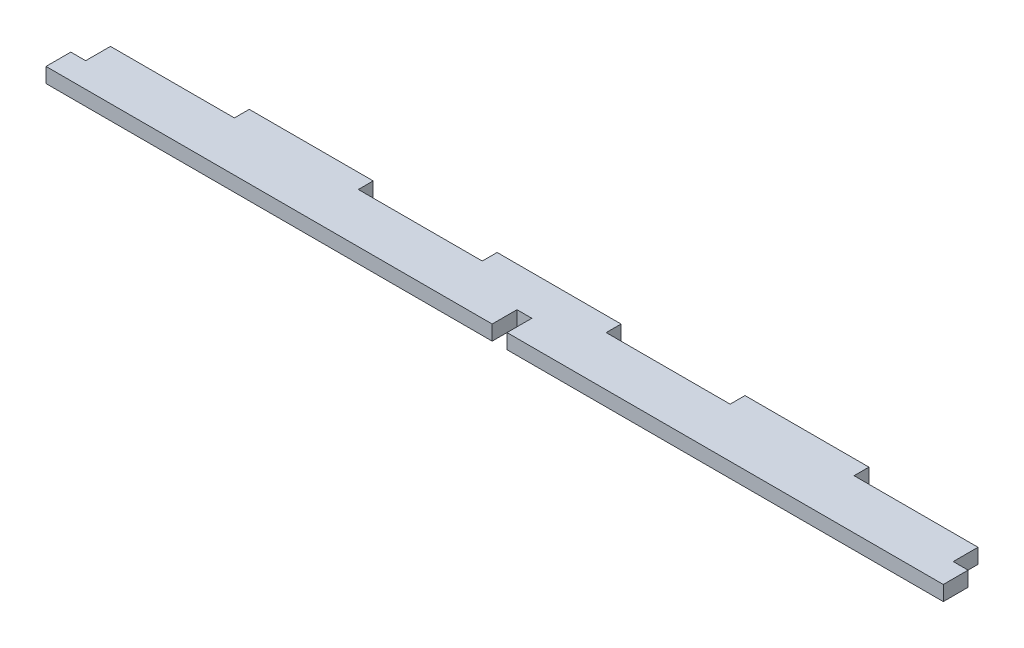
ISO-10303-21;
HEADER;
FILE_DESCRIPTION(('STEP AP214'),'2;1');
FILE_NAME('part.step','',(''),(''),'','','');
FILE_SCHEMA(('AUTOMOTIVE_DESIGN { 1 0 10303 214 1 1 1 1 }'));
ENDSEC;
DATA;
#1=APPLICATION_CONTEXT('core data for automotive mechanical design processes');
#2=APPLICATION_PROTOCOL_DEFINITION('international standard','automotive_design',2000,#1);
#3=PRODUCT_CONTEXT('',#1,'mechanical');
#4=PRODUCT('Part','Part','',(#3));
#5=PRODUCT_RELATED_PRODUCT_CATEGORY('part','',(#4));
#6=PRODUCT_DEFINITION_FORMATION('','',#4);
#7=PRODUCT_DEFINITION_CONTEXT('part definition',#1,'design');
#8=PRODUCT_DEFINITION('design','',#6,#7);
#9=PRODUCT_DEFINITION_SHAPE('','',#8);
#10=(LENGTH_UNIT() NAMED_UNIT(*) SI_UNIT(.MILLI.,.METRE.));
#11=(NAMED_UNIT(*) PLANE_ANGLE_UNIT() SI_UNIT($,.RADIAN.));
#12=(NAMED_UNIT(*) SI_UNIT($,.STERADIAN.) SOLID_ANGLE_UNIT());
#13=UNCERTAINTY_MEASURE_WITH_UNIT(LENGTH_MEASURE(1.E-05),#10,'distance_accuracy_value','');
#14=(GEOMETRIC_REPRESENTATION_CONTEXT(3) GLOBAL_UNCERTAINTY_ASSIGNED_CONTEXT((#13)) GLOBAL_UNIT_ASSIGNED_CONTEXT((#10,
#11,#12)) REPRESENTATION_CONTEXT('',''));
#15=CARTESIAN_POINT('',(0.,0.,0.));
#16=DIRECTION('',(0.,0.,1.));
#17=DIRECTION('',(1.,0.,0.));
#18=AXIS2_PLACEMENT_3D('',#15,#16,#17);
#19=CARTESIAN_POINT('',(0.,3.,0.));
#20=DIRECTION('',(0.,0.,-1.));
#21=DIRECTION('',(-1.,0.,0.));
#22=AXIS2_PLACEMENT_3D('',#19,#20,#21);
#23=PLANE('',#22);
#24=DIRECTION('',(0.,-1.,0.));
#25=VECTOR('',#24,1.);
#26=CARTESIAN_POINT('',(87.,3.00005,0.));
#27=LINE('',#26,#25);
#28=CARTESIAN_POINT('',(87.,3.,0.));
#29=VERTEX_POINT('',#28);
#30=CARTESIAN_POINT('',(87.,0.,0.));
#31=VERTEX_POINT('',#30);
#32=EDGE_CURVE('E196',#29,#31,#27,.T.);
#33=ORIENTED_EDGE('',*,*,#32,.F.);
#34=DIRECTION('',(1.,0.,0.));
#35=VECTOR('',#34,1.);
#36=CARTESIAN_POINT('',(0.,3.,0.));
#37=LINE('',#36,#35);
#38=CARTESIAN_POINT('',(-3.,3.,0.));
#39=VERTEX_POINT('',#38);
#40=EDGE_CURVE('E241',#39,#29,#37,.T.);
#41=ORIENTED_EDGE('',*,*,#40,.F.);
#42=DIRECTION('',(0.,-1.,0.));
#43=VECTOR('',#42,1.);
#44=CARTESIAN_POINT('',(-3.,28.1793566240284,0.));
#45=LINE('',#44,#43);
#46=CARTESIAN_POINT('',(-3.,0.,0.));
#47=VERTEX_POINT('',#46);
#48=EDGE_CURVE('E218',#39,#47,#45,.T.);
#49=ORIENTED_EDGE('',*,*,#48,.T.);
#50=DIRECTION('',(1.,0.,0.));
#51=VECTOR('',#50,1.);
#52=CARTESIAN_POINT('',(0.,0.,0.));
#53=LINE('',#52,#51);
#54=EDGE_CURVE('E210',#47,#31,#53,.T.);
#55=ORIENTED_EDGE('',*,*,#54,.T.);
#56=EDGE_LOOP('',(#33,#41,#49,#55));
#57=FACE_BOUND('',#56,.T.);
#58=ADVANCED_FACE('F33',(#57),#23,.F.);
#59=DIRECTION('',(0.,-1.,0.));
#60=VECTOR('',#59,1.);
#61=CARTESIAN_POINT('',(90.,3.00005,0.));
#62=LINE('',#61,#60);
#63=CARTESIAN_POINT('',(90.,3.,0.));
#64=VERTEX_POINT('',#63);
#65=CARTESIAN_POINT('',(90.,0.,0.));
#66=VERTEX_POINT('',#65);
#67=EDGE_CURVE('E204',#64,#66,#62,.T.);
#68=ORIENTED_EDGE('',*,*,#67,.T.);
#69=CARTESIAN_POINT('',(178.,0.,0.));
#70=VERTEX_POINT('',#69);
#71=EDGE_CURVE('E221',#66,#70,#53,.T.);
#72=ORIENTED_EDGE('',*,*,#71,.T.);
#73=DIRECTION('',(0.,-1.,0.));
#74=VECTOR('',#73,1.);
#75=CARTESIAN_POINT('',(178.,28.1793566240284,0.));
#76=LINE('',#75,#74);
#77=CARTESIAN_POINT('',(178.,3.,0.));
#78=VERTEX_POINT('',#77);
#79=EDGE_CURVE('E284',#78,#70,#76,.T.);
#80=ORIENTED_EDGE('',*,*,#79,.F.);
#81=EDGE_CURVE('E462',#64,#78,#37,.T.);
#82=ORIENTED_EDGE('',*,*,#81,.F.);
#83=EDGE_LOOP('',(#68,#72,#80,#82));
#84=FACE_BOUND('',#83,.T.);
#85=ADVANCED_FACE('F431',(#84),#23,.F.);
#86=CARTESIAN_POINT('',(0.,3.,0.));
#87=DIRECTION('',(0.,1.,0.));
#88=DIRECTION('',(0.,0.,1.));
#89=AXIS2_PLACEMENT_3D('',#86,#87,#88);
#90=PLANE('',#89);
#91=ORIENTED_EDGE('',*,*,#40,.T.);
#92=DIRECTION('',(0.,0.,-1.));
#93=VECTOR('',#92,1.);
#94=CARTESIAN_POINT('',(87.,3.,0.));
#95=LINE('',#94,#93);
#96=CARTESIAN_POINT('',(87.,3.,-5.));
#97=VERTEX_POINT('',#96);
#98=EDGE_CURVE('E199',#29,#97,#95,.T.);
#99=ORIENTED_EDGE('',*,*,#98,.T.);
#100=DIRECTION('',(1.,0.,0.));
#101=VECTOR('',#100,1.);
#102=CARTESIAN_POINT('',(0.,3.,-5.));
#103=LINE('',#102,#101);
#104=CARTESIAN_POINT('',(90.,3.,-5.));
#105=VERTEX_POINT('',#104);
#106=EDGE_CURVE('E203',#97,#105,#103,.T.);
#107=ORIENTED_EDGE('',*,*,#106,.T.);
#108=DIRECTION('',(0.,0.,1.));
#109=VECTOR('',#108,1.);
#110=CARTESIAN_POINT('',(90.,3.,0.));
#111=LINE('',#110,#109);
#112=EDGE_CURVE('E473',#105,#64,#111,.T.);
#113=ORIENTED_EDGE('',*,*,#112,.T.);
#114=ORIENTED_EDGE('',*,*,#81,.T.);
#115=DIRECTION('',(0.,0.,-1.));
#116=VECTOR('',#115,1.);
#117=CARTESIAN_POINT('',(178.,3.,0.));
#118=LINE('',#117,#116);
#119=CARTESIAN_POINT('',(178.,3.,-5.00000000000002));
#120=VERTEX_POINT('',#119);
#121=EDGE_CURVE('E280',#78,#120,#118,.T.);
#122=ORIENTED_EDGE('',*,*,#121,.T.);
#123=DIRECTION('',(-1.,0.,0.));
#124=VECTOR('',#123,1.);
#125=CARTESIAN_POINT('',(175.,3.,-5.00000000000002));
#126=LINE('',#125,#124);
#127=CARTESIAN_POINT('',(175.,3.,-5.00000000000002));
#128=VERTEX_POINT('',#127);
#129=EDGE_CURVE('E277',#120,#128,#126,.T.);
#130=ORIENTED_EDGE('',*,*,#129,.T.);
#131=DIRECTION('',(0.,0.,-1.));
#132=VECTOR('',#131,1.);
#133=CARTESIAN_POINT('',(175.,3.,-10.));
#134=LINE('',#133,#132);
#135=CARTESIAN_POINT('',(175.,3.,-10.));
#136=VERTEX_POINT('',#135);
#137=EDGE_CURVE('E237',#128,#136,#134,.T.);
#138=ORIENTED_EDGE('',*,*,#137,.T.);
#139=DIRECTION('',(-1.,0.,0.));
#140=VECTOR('',#139,1.);
#141=CARTESIAN_POINT('',(0.,3.,-10.));
#142=LINE('',#141,#140);
#143=CARTESIAN_POINT('',(150.,3.,-10.));
#144=VERTEX_POINT('',#143);
#145=EDGE_CURVE('E254',#136,#144,#142,.T.);
#146=ORIENTED_EDGE('',*,*,#145,.T.);
#147=DIRECTION('',(0.,0.,-1.));
#148=VECTOR('',#147,1.);
#149=CARTESIAN_POINT('',(150.,3.,-10.));
#150=LINE('',#149,#148);
#151=CARTESIAN_POINT('',(150.,3.,-13.));
#152=VERTEX_POINT('',#151);
#153=EDGE_CURVE('E370',#144,#152,#150,.T.);
#154=ORIENTED_EDGE('',*,*,#153,.T.);
#155=DIRECTION('',(-1.,0.,0.));
#156=VECTOR('',#155,1.);
#157=CARTESIAN_POINT('',(125.,3.,-13.));
#158=LINE('',#157,#156);
#159=CARTESIAN_POINT('',(125.,3.,-13.));
#160=VERTEX_POINT('',#159);
#161=EDGE_CURVE('E480',#152,#160,#158,.T.);
#162=ORIENTED_EDGE('',*,*,#161,.T.);
#163=DIRECTION('',(0.,0.,1.));
#164=VECTOR('',#163,1.);
#165=CARTESIAN_POINT('',(125.,3.,-10.));
#166=LINE('',#165,#164);
#167=CARTESIAN_POINT('',(125.,3.,-10.));
#168=VERTEX_POINT('',#167);
#169=EDGE_CURVE('E340',#160,#168,#166,.T.);
#170=ORIENTED_EDGE('',*,*,#169,.T.);
#171=CARTESIAN_POINT('',(100.,3.,-10.));
#172=VERTEX_POINT('',#171);
#173=EDGE_CURVE('E37',#168,#172,#142,.T.);
#174=ORIENTED_EDGE('',*,*,#173,.T.);
#175=DIRECTION('',(0.,0.,-1.));
#176=VECTOR('',#175,1.);
#177=CARTESIAN_POINT('',(100.,3.,-10.));
#178=LINE('',#177,#176);
#179=CARTESIAN_POINT('',(100.,3.,-13.));
#180=VERTEX_POINT('',#179);
#181=EDGE_CURVE('E337',#172,#180,#178,.T.);
#182=ORIENTED_EDGE('',*,*,#181,.T.);
#183=DIRECTION('',(-1.,0.,0.));
#184=VECTOR('',#183,1.);
#185=CARTESIAN_POINT('',(75.,3.,-13.));
#186=LINE('',#185,#184);
#187=CARTESIAN_POINT('',(75.,3.,-13.));
#188=VERTEX_POINT('',#187);
#189=EDGE_CURVE('E358',#180,#188,#186,.T.);
#190=ORIENTED_EDGE('',*,*,#189,.T.);
#191=DIRECTION('',(0.,0.,1.));
#192=VECTOR('',#191,1.);
#193=CARTESIAN_POINT('',(75.,3.,-10.));
#194=LINE('',#193,#192);
#195=CARTESIAN_POINT('',(75.,3.,-10.));
#196=VERTEX_POINT('',#195);
#197=EDGE_CURVE('E353',#188,#196,#194,.T.);
#198=ORIENTED_EDGE('',*,*,#197,.T.);
#199=CARTESIAN_POINT('',(50.,3.,-10.));
#200=VERTEX_POINT('',#199);
#201=EDGE_CURVE('E257',#196,#200,#142,.T.);
#202=ORIENTED_EDGE('',*,*,#201,.T.);
#203=DIRECTION('',(0.,0.,-1.));
#204=VECTOR('',#203,1.);
#205=CARTESIAN_POINT('',(50.,3.,-10.));
#206=LINE('',#205,#204);
#207=CARTESIAN_POINT('',(50.,3.,-13.));
#208=VERTEX_POINT('',#207);
#209=EDGE_CURVE('E285',#200,#208,#206,.T.);
#210=ORIENTED_EDGE('',*,*,#209,.T.);
#211=DIRECTION('',(-1.,0.,0.));
#212=VECTOR('',#211,1.);
#213=CARTESIAN_POINT('',(25.,3.,-13.));
#214=LINE('',#213,#212);
#215=CARTESIAN_POINT('',(25.,3.,-13.));
#216=VERTEX_POINT('',#215);
#217=EDGE_CURVE('E374',#208,#216,#214,.T.);
#218=ORIENTED_EDGE('',*,*,#217,.T.);
#219=DIRECTION('',(0.,0.,1.));
#220=VECTOR('',#219,1.);
#221=CARTESIAN_POINT('',(25.,3.,-10.));
#222=LINE('',#221,#220);
#223=CARTESIAN_POINT('',(25.,3.,-10.));
#224=VERTEX_POINT('',#223);
#225=EDGE_CURVE('E378',#216,#224,#222,.T.);
#226=ORIENTED_EDGE('',*,*,#225,.T.);
#227=CARTESIAN_POINT('',(0.,3.,-10.));
#228=VERTEX_POINT('',#227);
#229=EDGE_CURVE('E240',#224,#228,#142,.T.);
#230=ORIENTED_EDGE('',*,*,#229,.T.);
#231=DIRECTION('',(0.,0.,1.));
#232=VECTOR('',#231,1.);
#233=CARTESIAN_POINT('',(0.,3.,-10.));
#234=LINE('',#233,#232);
#235=CARTESIAN_POINT('',(0.,3.,-5.));
#236=VERTEX_POINT('',#235);
#237=EDGE_CURVE('E264',#228,#236,#234,.T.);
#238=ORIENTED_EDGE('',*,*,#237,.T.);
#239=DIRECTION('',(-1.,0.,0.));
#240=VECTOR('',#239,1.);
#241=CARTESIAN_POINT('',(0.,3.,-5.));
#242=LINE('',#241,#240);
#243=CARTESIAN_POINT('',(-3.,3.,-5.));
#244=VERTEX_POINT('',#243);
#245=EDGE_CURVE('E298',#236,#244,#242,.T.);
#246=ORIENTED_EDGE('',*,*,#245,.T.);
#247=DIRECTION('',(0.,0.,1.));
#248=VECTOR('',#247,1.);
#249=CARTESIAN_POINT('',(-3.,3.,0.));
#250=LINE('',#249,#248);
#251=EDGE_CURVE('E295',#244,#39,#250,.T.);
#252=ORIENTED_EDGE('',*,*,#251,.T.);
#253=EDGE_LOOP('',(#91,#99,#107,#113,#114,#122,#130,#138,#146,#154,#162,#170,#174,#182,#190,
#198,#202,#210,#218,#226,#230,#238,#246,#252));
#254=FACE_BOUND('',#253,.T.);
#255=ADVANCED_FACE('F317',(#254),#90,.T.);
#256=CARTESIAN_POINT('',(0.,0.,0.));
#257=DIRECTION('',(0.,1.,0.));
#258=DIRECTION('',(0.,0.,1.));
#259=AXIS2_PLACEMENT_3D('',#256,#257,#258);
#260=PLANE('',#259);
#261=DIRECTION('',(0.,0.,1.));
#262=VECTOR('',#261,1.);
#263=CARTESIAN_POINT('',(87.,0.,0.));
#264=LINE('',#263,#262);
#265=CARTESIAN_POINT('',(87.,0.,-5.));
#266=VERTEX_POINT('',#265);
#267=EDGE_CURVE('E51',#266,#31,#264,.T.);
#268=ORIENTED_EDGE('',*,*,#267,.T.);
#269=ORIENTED_EDGE('',*,*,#54,.F.);
#270=DIRECTION('',(0.,0.,1.));
#271=VECTOR('',#270,1.);
#272=CARTESIAN_POINT('',(-3.,0.,0.));
#273=LINE('',#272,#271);
#274=CARTESIAN_POINT('',(-3.,0.,-5.));
#275=VERTEX_POINT('',#274);
#276=EDGE_CURVE('E292',#275,#47,#273,.T.);
#277=ORIENTED_EDGE('',*,*,#276,.F.);
#278=DIRECTION('',(-1.,0.,0.));
#279=VECTOR('',#278,1.);
#280=CARTESIAN_POINT('',(0.,0.,-5.));
#281=LINE('',#280,#279);
#282=CARTESIAN_POINT('',(0.,0.,-5.));
#283=VERTEX_POINT('',#282);
#284=EDGE_CURVE('E307',#283,#275,#281,.T.);
#285=ORIENTED_EDGE('',*,*,#284,.F.);
#286=DIRECTION('',(0.,0.,1.));
#287=VECTOR('',#286,1.);
#288=CARTESIAN_POINT('',(0.,0.,-10.));
#289=LINE('',#288,#287);
#290=CARTESIAN_POINT('',(0.,0.,-10.));
#291=VERTEX_POINT('',#290);
#292=EDGE_CURVE('E225',#291,#283,#289,.T.);
#293=ORIENTED_EDGE('',*,*,#292,.F.);
#294=DIRECTION('',(-1.,0.,0.));
#295=VECTOR('',#294,1.);
#296=CARTESIAN_POINT('',(0.,0.,-10.));
#297=LINE('',#296,#295);
#298=CARTESIAN_POINT('',(25.,0.,-10.));
#299=VERTEX_POINT('',#298);
#300=EDGE_CURVE('E223',#299,#291,#297,.T.);
#301=ORIENTED_EDGE('',*,*,#300,.F.);
#302=DIRECTION('',(0.,0.,1.));
#303=VECTOR('',#302,1.);
#304=CARTESIAN_POINT('',(25.,0.,-10.));
#305=LINE('',#304,#303);
#306=CARTESIAN_POINT('',(25.,0.,-13.));
#307=VERTEX_POINT('',#306);
#308=EDGE_CURVE('E355',#307,#299,#305,.T.);
#309=ORIENTED_EDGE('',*,*,#308,.F.);
#310=DIRECTION('',(-1.,0.,0.));
#311=VECTOR('',#310,1.);
#312=CARTESIAN_POINT('',(25.,0.,-13.));
#313=LINE('',#312,#311);
#314=CARTESIAN_POINT('',(50.,0.,-13.));
#315=VERTEX_POINT('',#314);
#316=EDGE_CURVE('E371',#315,#307,#313,.T.);
#317=ORIENTED_EDGE('',*,*,#316,.F.);
#318=DIRECTION('',(0.,0.,-1.));
#319=VECTOR('',#318,1.);
#320=CARTESIAN_POINT('',(50.,0.,-10.));
#321=LINE('',#320,#319);
#322=CARTESIAN_POINT('',(50.,0.,-10.));
#323=VERTEX_POINT('',#322);
#324=EDGE_CURVE('E402',#323,#315,#321,.T.);
#325=ORIENTED_EDGE('',*,*,#324,.F.);
#326=CARTESIAN_POINT('',(75.,0.,-10.));
#327=VERTEX_POINT('',#326);
#328=EDGE_CURVE('E259',#327,#323,#297,.T.);
#329=ORIENTED_EDGE('',*,*,#328,.F.);
#330=DIRECTION('',(0.,0.,1.));
#331=VECTOR('',#330,1.);
#332=CARTESIAN_POINT('',(75.,0.,-10.));
#333=LINE('',#332,#331);
#334=CARTESIAN_POINT('',(75.,0.,-13.));
#335=VERTEX_POINT('',#334);
#336=EDGE_CURVE('E361',#335,#327,#333,.T.);
#337=ORIENTED_EDGE('',*,*,#336,.F.);
#338=DIRECTION('',(-1.,0.,0.));
#339=VECTOR('',#338,1.);
#340=CARTESIAN_POINT('',(75.,0.,-13.));
#341=LINE('',#340,#339);
#342=CARTESIAN_POINT('',(100.,0.,-13.));
#343=VERTEX_POINT('',#342);
#344=EDGE_CURVE('E365',#343,#335,#341,.T.);
#345=ORIENTED_EDGE('',*,*,#344,.F.);
#346=DIRECTION('',(0.,0.,-1.));
#347=VECTOR('',#346,1.);
#348=CARTESIAN_POINT('',(100.,0.,-10.));
#349=LINE('',#348,#347);
#350=CARTESIAN_POINT('',(100.,0.,-10.));
#351=VERTEX_POINT('',#350);
#352=EDGE_CURVE('E346',#351,#343,#349,.T.);
#353=ORIENTED_EDGE('',*,*,#352,.F.);
#354=CARTESIAN_POINT('',(125.,0.,-10.));
#355=VERTEX_POINT('',#354);
#356=EDGE_CURVE('E261',#355,#351,#297,.T.);
#357=ORIENTED_EDGE('',*,*,#356,.F.);
#358=DIRECTION('',(0.,0.,1.));
#359=VECTOR('',#358,1.);
#360=CARTESIAN_POINT('',(125.,0.,-10.));
#361=LINE('',#360,#359);
#362=CARTESIAN_POINT('',(125.,0.,-13.));
#363=VERTEX_POINT('',#362);
#364=EDGE_CURVE('E486',#363,#355,#361,.T.);
#365=ORIENTED_EDGE('',*,*,#364,.F.);
#366=DIRECTION('',(-1.,0.,0.));
#367=VECTOR('',#366,1.);
#368=CARTESIAN_POINT('',(125.,0.,-13.));
#369=LINE('',#368,#367);
#370=CARTESIAN_POINT('',(150.,0.,-13.));
#371=VERTEX_POINT('',#370);
#372=EDGE_CURVE('E477',#371,#363,#369,.T.);
#373=ORIENTED_EDGE('',*,*,#372,.F.);
#374=DIRECTION('',(0.,0.,-1.));
#375=VECTOR('',#374,1.);
#376=CARTESIAN_POINT('',(150.,0.,-10.));
#377=LINE('',#376,#375);
#378=CARTESIAN_POINT('',(150.,0.,-10.));
#379=VERTEX_POINT('',#378);
#380=EDGE_CURVE('E482',#379,#371,#377,.T.);
#381=ORIENTED_EDGE('',*,*,#380,.F.);
#382=CARTESIAN_POINT('',(175.,0.,-10.));
#383=VERTEX_POINT('',#382);
#384=EDGE_CURVE('E262',#383,#379,#297,.T.);
#385=ORIENTED_EDGE('',*,*,#384,.F.);
#386=DIRECTION('',(0.,0.,-1.));
#387=VECTOR('',#386,1.);
#388=CARTESIAN_POINT('',(175.,0.,-10.));
#389=LINE('',#388,#387);
#390=CARTESIAN_POINT('',(175.,0.,-5.00000000000002));
#391=VERTEX_POINT('',#390);
#392=EDGE_CURVE('E220',#391,#383,#389,.T.);
#393=ORIENTED_EDGE('',*,*,#392,.F.);
#394=DIRECTION('',(-1.,0.,0.));
#395=VECTOR('',#394,1.);
#396=CARTESIAN_POINT('',(175.,0.,-5.00000000000002));
#397=LINE('',#396,#395);
#398=CARTESIAN_POINT('',(178.,0.,-5.00000000000002));
#399=VERTEX_POINT('',#398);
#400=EDGE_CURVE('E242',#399,#391,#397,.T.);
#401=ORIENTED_EDGE('',*,*,#400,.F.);
#402=DIRECTION('',(0.,0.,-1.));
#403=VECTOR('',#402,1.);
#404=CARTESIAN_POINT('',(178.,0.,0.));
#405=LINE('',#404,#403);
#406=EDGE_CURVE('E452',#70,#399,#405,.T.);
#407=ORIENTED_EDGE('',*,*,#406,.F.);
#408=ORIENTED_EDGE('',*,*,#71,.F.);
#409=DIRECTION('',(0.,0.,-1.));
#410=VECTOR('',#409,1.);
#411=CARTESIAN_POINT('',(90.,0.,0.));
#412=LINE('',#411,#410);
#413=CARTESIAN_POINT('',(90.,0.,-5.));
#414=VERTEX_POINT('',#413);
#415=EDGE_CURVE('E215',#66,#414,#412,.T.);
#416=ORIENTED_EDGE('',*,*,#415,.T.);
#417=DIRECTION('',(-1.,0.,0.));
#418=VECTOR('',#417,1.);
#419=CARTESIAN_POINT('',(87.,0.,-5.));
#420=LINE('',#419,#418);
#421=EDGE_CURVE('E214',#414,#266,#420,.T.);
#422=ORIENTED_EDGE('',*,*,#421,.T.);
#423=EDGE_LOOP('',(#268,#269,#277,#285,#293,#301,#309,#317,#325,#329,#337,#345,#353,#357,#365,
#373,#381,#385,#393,#401,#407,#408,#416,#422));
#424=FACE_BOUND('',#423,.T.);
#425=ADVANCED_FACE('F208',(#424),#260,.F.);
#426=CARTESIAN_POINT('',(0.,3.,-10.));
#427=DIRECTION('',(0.,0.,1.));
#428=DIRECTION('',(1.,0.,0.));
#429=AXIS2_PLACEMENT_3D('',#426,#427,#428);
#430=PLANE('',#429);
#431=DIRECTION('',(0.,-1.,0.));
#432=VECTOR('',#431,1.);
#433=CARTESIAN_POINT('',(125.,28.1793566240284,-10.));
#434=LINE('',#433,#432);
#435=EDGE_CURVE('E489',#168,#355,#434,.T.);
#436=ORIENTED_EDGE('',*,*,#435,.T.);
#437=ORIENTED_EDGE('',*,*,#356,.T.);
#438=DIRECTION('',(0.,-1.,0.));
#439=VECTOR('',#438,1.);
#440=CARTESIAN_POINT('',(100.,28.1793566240284,-10.));
#441=LINE('',#440,#439);
#442=EDGE_CURVE('E341',#172,#351,#441,.T.);
#443=ORIENTED_EDGE('',*,*,#442,.F.);
#444=ORIENTED_EDGE('',*,*,#173,.F.);
#445=EDGE_LOOP('',(#436,#437,#443,#444));
#446=FACE_BOUND('',#445,.T.);
#447=ADVANCED_FACE('F342',(#446),#430,.F.);
#448=DIRECTION('',(0.,-1.,0.));
#449=VECTOR('',#448,1.);
#450=CARTESIAN_POINT('',(150.,28.1793566240284,-10.));
#451=LINE('',#450,#449);
#452=EDGE_CURVE('E485',#144,#379,#451,.T.);
#453=ORIENTED_EDGE('',*,*,#452,.F.);
#454=ORIENTED_EDGE('',*,*,#145,.F.);
#455=DIRECTION('',(0.,-1.,0.));
#456=VECTOR('',#455,1.);
#457=CARTESIAN_POINT('',(175.,3.,-10.));
#458=LINE('',#457,#456);
#459=EDGE_CURVE('E11',#136,#383,#458,.T.);
#460=ORIENTED_EDGE('',*,*,#459,.T.);
#461=ORIENTED_EDGE('',*,*,#384,.T.);
#462=EDGE_LOOP('',(#453,#454,#460,#461));
#463=FACE_BOUND('',#462,.T.);
#464=ADVANCED_FACE('F418',(#463),#430,.F.);
#465=DIRECTION('',(0.,-1.,0.));
#466=VECTOR('',#465,1.);
#467=CARTESIAN_POINT('',(75.,28.1793566240284,-10.));
#468=LINE('',#467,#466);
#469=EDGE_CURVE('E347',#196,#327,#468,.T.);
#470=ORIENTED_EDGE('',*,*,#469,.T.);
#471=ORIENTED_EDGE('',*,*,#328,.T.);
#472=DIRECTION('',(0.,-1.,0.));
#473=VECTOR('',#472,1.);
#474=CARTESIAN_POINT('',(50.,28.1793566240284,-10.));
#475=LINE('',#474,#473);
#476=EDGE_CURVE('E387',#200,#323,#475,.T.);
#477=ORIENTED_EDGE('',*,*,#476,.F.);
#478=ORIENTED_EDGE('',*,*,#201,.F.);
#479=EDGE_LOOP('',(#470,#471,#477,#478));
#480=FACE_BOUND('',#479,.T.);
#481=ADVANCED_FACE('F415',(#480),#430,.F.);
#482=CARTESIAN_POINT('',(0.,3.,-10.));
#483=DIRECTION('',(1.,0.,0.));
#484=DIRECTION('',(0.,0.,-1.));
#485=AXIS2_PLACEMENT_3D('',#482,#483,#484);
#486=PLANE('',#485);
#487=DIRECTION('',(0.,-1.,0.));
#488=VECTOR('',#487,1.);
#489=CARTESIAN_POINT('',(0.,28.1793566240284,-5.));
#490=LINE('',#489,#488);
#491=EDGE_CURVE('E303',#236,#283,#490,.T.);
#492=ORIENTED_EDGE('',*,*,#491,.F.);
#493=ORIENTED_EDGE('',*,*,#237,.F.);
#494=DIRECTION('',(0.,-1.,0.));
#495=VECTOR('',#494,1.);
#496=CARTESIAN_POINT('',(0.,3.,-10.));
#497=LINE('',#496,#495);
#498=EDGE_CURVE('E43',#228,#291,#497,.T.);
#499=ORIENTED_EDGE('',*,*,#498,.T.);
#500=ORIENTED_EDGE('',*,*,#292,.T.);
#501=EDGE_LOOP('',(#492,#493,#499,#500));
#502=FACE_BOUND('',#501,.T.);
#503=ADVANCED_FACE('F35',(#502),#486,.F.);
#504=CARTESIAN_POINT('',(175.,3.,-10.));
#505=DIRECTION('',(-1.,0.,0.));
#506=DIRECTION('',(0.,0.,1.));
#507=AXIS2_PLACEMENT_3D('',#504,#505,#506);
#508=PLANE('',#507);
#509=ORIENTED_EDGE('',*,*,#137,.F.);
#510=DIRECTION('',(0.,-1.,0.));
#511=VECTOR('',#510,1.);
#512=CARTESIAN_POINT('',(175.,28.1793566240284,-5.00000000000002));
#513=LINE('',#512,#511);
#514=EDGE_CURVE('E281',#128,#391,#513,.T.);
#515=ORIENTED_EDGE('',*,*,#514,.T.);
#516=ORIENTED_EDGE('',*,*,#392,.T.);
#517=ORIENTED_EDGE('',*,*,#459,.F.);
#518=EDGE_LOOP('',(#509,#515,#516,#517));
#519=FACE_BOUND('',#518,.T.);
#520=ADVANCED_FACE('F425',(#519),#508,.F.);
#521=ORIENTED_EDGE('',*,*,#229,.F.);
#522=DIRECTION('',(0.,-1.,0.));
#523=VECTOR('',#522,1.);
#524=CARTESIAN_POINT('',(25.,28.1793566240284,-10.));
#525=LINE('',#524,#523);
#526=EDGE_CURVE('E384',#224,#299,#525,.T.);
#527=ORIENTED_EDGE('',*,*,#526,.T.);
#528=ORIENTED_EDGE('',*,*,#300,.T.);
#529=ORIENTED_EDGE('',*,*,#498,.F.);
#530=EDGE_LOOP('',(#521,#527,#528,#529));
#531=FACE_BOUND('',#530,.T.);
#532=ADVANCED_FACE('F420',(#531),#430,.F.);
#533=CARTESIAN_POINT('',(0.,28.1793566240284,-5.));
#534=DIRECTION('',(0.,0.,1.));
#535=DIRECTION('',(1.,0.,0.));
#536=AXIS2_PLACEMENT_3D('',#533,#534,#535);
#537=PLANE('',#536);
#538=ORIENTED_EDGE('',*,*,#245,.F.);
#539=ORIENTED_EDGE('',*,*,#491,.T.);
#540=ORIENTED_EDGE('',*,*,#284,.T.);
#541=DIRECTION('',(0.,-1.,0.));
#542=VECTOR('',#541,1.);
#543=CARTESIAN_POINT('',(-3.,28.1793566240284,-5.));
#544=LINE('',#543,#542);
#545=EDGE_CURVE('E294',#244,#275,#544,.T.);
#546=ORIENTED_EDGE('',*,*,#545,.F.);
#547=EDGE_LOOP('',(#538,#539,#540,#546));
#548=FACE_BOUND('',#547,.T.);
#549=ADVANCED_FACE('F321',(#548),#537,.F.);
#550=CARTESIAN_POINT('',(-3.,28.1793566240284,0.));
#551=DIRECTION('',(1.,0.,0.));
#552=DIRECTION('',(0.,0.,-1.));
#553=AXIS2_PLACEMENT_3D('',#550,#551,#552);
#554=PLANE('',#553);
#555=ORIENTED_EDGE('',*,*,#251,.F.);
#556=ORIENTED_EDGE('',*,*,#545,.T.);
#557=ORIENTED_EDGE('',*,*,#276,.T.);
#558=ORIENTED_EDGE('',*,*,#48,.F.);
#559=EDGE_LOOP('',(#555,#556,#557,#558));
#560=FACE_BOUND('',#559,.T.);
#561=ADVANCED_FACE('F324',(#560),#554,.F.);
#562=CARTESIAN_POINT('',(178.,28.1793566240284,0.));
#563=DIRECTION('',(-1.,0.,0.));
#564=DIRECTION('',(0.,0.,1.));
#565=AXIS2_PLACEMENT_3D('',#562,#563,#564);
#566=PLANE('',#565);
#567=ORIENTED_EDGE('',*,*,#121,.F.);
#568=ORIENTED_EDGE('',*,*,#79,.T.);
#569=ORIENTED_EDGE('',*,*,#406,.T.);
#570=DIRECTION('',(0.,-1.,0.));
#571=VECTOR('',#570,1.);
#572=CARTESIAN_POINT('',(178.,28.1793566240284,-5.00000000000002));
#573=LINE('',#572,#571);
#574=EDGE_CURVE('E290',#120,#399,#573,.T.);
#575=ORIENTED_EDGE('',*,*,#574,.F.);
#576=EDGE_LOOP('',(#567,#568,#569,#575));
#577=FACE_BOUND('',#576,.T.);
#578=ADVANCED_FACE('F458',(#577),#566,.F.);
#579=CARTESIAN_POINT('',(175.,28.1793566240284,-5.00000000000002));
#580=DIRECTION('',(0.,0.,1.));
#581=DIRECTION('',(1.,0.,0.));
#582=AXIS2_PLACEMENT_3D('',#579,#580,#581);
#583=PLANE('',#582);
#584=ORIENTED_EDGE('',*,*,#129,.F.);
#585=ORIENTED_EDGE('',*,*,#574,.T.);
#586=ORIENTED_EDGE('',*,*,#400,.T.);
#587=ORIENTED_EDGE('',*,*,#514,.F.);
#588=EDGE_LOOP('',(#584,#585,#586,#587));
#589=FACE_BOUND('',#588,.T.);
#590=ADVANCED_FACE('F448',(#589),#583,.F.);
#591=CARTESIAN_POINT('',(25.,28.1793566240284,-10.));
#592=DIRECTION('',(1.,0.,0.));
#593=DIRECTION('',(0.,0.,-1.));
#594=AXIS2_PLACEMENT_3D('',#591,#592,#593);
#595=PLANE('',#594);
#596=ORIENTED_EDGE('',*,*,#225,.F.);
#597=DIRECTION('',(0.,-1.,0.));
#598=VECTOR('',#597,1.);
#599=CARTESIAN_POINT('',(25.,28.1793566240284,-13.));
#600=LINE('',#599,#598);
#601=EDGE_CURVE('E352',#216,#307,#600,.T.);
#602=ORIENTED_EDGE('',*,*,#601,.T.);
#603=ORIENTED_EDGE('',*,*,#308,.T.);
#604=ORIENTED_EDGE('',*,*,#526,.F.);
#605=EDGE_LOOP('',(#596,#602,#603,#604));
#606=FACE_BOUND('',#605,.T.);
#607=ADVANCED_FACE('F398',(#606),#595,.F.);
#608=CARTESIAN_POINT('',(50.,28.1793566240284,-10.));
#609=DIRECTION('',(-1.,0.,0.));
#610=DIRECTION('',(0.,0.,1.));
#611=AXIS2_PLACEMENT_3D('',#608,#609,#610);
#612=PLANE('',#611);
#613=ORIENTED_EDGE('',*,*,#209,.F.);
#614=ORIENTED_EDGE('',*,*,#476,.T.);
#615=ORIENTED_EDGE('',*,*,#324,.T.);
#616=DIRECTION('',(0.,-1.,0.));
#617=VECTOR('',#616,1.);
#618=CARTESIAN_POINT('',(50.,28.1793566240284,-13.));
#619=LINE('',#618,#617);
#620=EDGE_CURVE('E375',#208,#315,#619,.T.);
#621=ORIENTED_EDGE('',*,*,#620,.F.);
#622=EDGE_LOOP('',(#613,#614,#615,#621));
#623=FACE_BOUND('',#622,.T.);
#624=ADVANCED_FACE('F409',(#623),#612,.F.);
#625=CARTESIAN_POINT('',(25.,28.1793566240284,-13.));
#626=DIRECTION('',(0.,0.,1.));
#627=DIRECTION('',(1.,0.,0.));
#628=AXIS2_PLACEMENT_3D('',#625,#626,#627);
#629=PLANE('',#628);
#630=ORIENTED_EDGE('',*,*,#217,.F.);
#631=ORIENTED_EDGE('',*,*,#620,.T.);
#632=ORIENTED_EDGE('',*,*,#316,.T.);
#633=ORIENTED_EDGE('',*,*,#601,.F.);
#634=EDGE_LOOP('',(#630,#631,#632,#633));
#635=FACE_BOUND('',#634,.T.);
#636=ADVANCED_FACE('F405',(#635),#629,.F.);
#637=CARTESIAN_POINT('',(75.,28.1793566240284,-10.));
#638=DIRECTION('',(1.,0.,0.));
#639=DIRECTION('',(0.,0.,-1.));
#640=AXIS2_PLACEMENT_3D('',#637,#638,#639);
#641=PLANE('',#640);
#642=ORIENTED_EDGE('',*,*,#197,.F.);
#643=DIRECTION('',(0.,-1.,0.));
#644=VECTOR('',#643,1.);
#645=CARTESIAN_POINT('',(75.,28.1793566240284,-13.));
#646=LINE('',#645,#644);
#647=EDGE_CURVE('E368',#188,#335,#646,.T.);
#648=ORIENTED_EDGE('',*,*,#647,.T.);
#649=ORIENTED_EDGE('',*,*,#336,.T.);
#650=ORIENTED_EDGE('',*,*,#469,.F.);
#651=EDGE_LOOP('',(#642,#648,#649,#650));
#652=FACE_BOUND('',#651,.T.);
#653=ADVANCED_FACE('F504',(#652),#641,.F.);
#654=CARTESIAN_POINT('',(100.,28.1793566240284,-10.));
#655=DIRECTION('',(-1.,0.,0.));
#656=DIRECTION('',(0.,0.,1.));
#657=AXIS2_PLACEMENT_3D('',#654,#655,#656);
#658=PLANE('',#657);
#659=ORIENTED_EDGE('',*,*,#181,.F.);
#660=ORIENTED_EDGE('',*,*,#442,.T.);
#661=ORIENTED_EDGE('',*,*,#352,.T.);
#662=DIRECTION('',(0.,-1.,0.));
#663=VECTOR('',#662,1.);
#664=CARTESIAN_POINT('',(100.,28.1793566240284,-13.));
#665=LINE('',#664,#663);
#666=EDGE_CURVE('E350',#180,#343,#665,.T.);
#667=ORIENTED_EDGE('',*,*,#666,.F.);
#668=EDGE_LOOP('',(#659,#660,#661,#667));
#669=FACE_BOUND('',#668,.T.);
#670=ADVANCED_FACE('F349',(#669),#658,.F.);
#671=CARTESIAN_POINT('',(75.,28.1793566240284,-13.));
#672=DIRECTION('',(0.,0.,1.));
#673=DIRECTION('',(1.,0.,0.));
#674=AXIS2_PLACEMENT_3D('',#671,#672,#673);
#675=PLANE('',#674);
#676=ORIENTED_EDGE('',*,*,#189,.F.);
#677=ORIENTED_EDGE('',*,*,#666,.T.);
#678=ORIENTED_EDGE('',*,*,#344,.T.);
#679=ORIENTED_EDGE('',*,*,#647,.F.);
#680=EDGE_LOOP('',(#676,#677,#678,#679));
#681=FACE_BOUND('',#680,.T.);
#682=ADVANCED_FACE('F502',(#681),#675,.F.);
#683=CARTESIAN_POINT('',(125.,28.1793566240284,-10.));
#684=DIRECTION('',(1.,0.,0.));
#685=DIRECTION('',(0.,0.,-1.));
#686=AXIS2_PLACEMENT_3D('',#683,#684,#685);
#687=PLANE('',#686);
#688=ORIENTED_EDGE('',*,*,#169,.F.);
#689=DIRECTION('',(0.,-1.,0.));
#690=VECTOR('',#689,1.);
#691=CARTESIAN_POINT('',(125.,28.1793566240284,-13.));
#692=LINE('',#691,#690);
#693=EDGE_CURVE('E476',#160,#363,#692,.T.);
#694=ORIENTED_EDGE('',*,*,#693,.T.);
#695=ORIENTED_EDGE('',*,*,#364,.T.);
#696=ORIENTED_EDGE('',*,*,#435,.F.);
#697=EDGE_LOOP('',(#688,#694,#695,#696));
#698=FACE_BOUND('',#697,.T.);
#699=ADVANCED_FACE('F620',(#698),#687,.F.);
#700=CARTESIAN_POINT('',(150.,28.1793566240284,-10.));
#701=DIRECTION('',(-1.,0.,0.));
#702=DIRECTION('',(0.,0.,1.));
#703=AXIS2_PLACEMENT_3D('',#700,#701,#702);
#704=PLANE('',#703);
#705=ORIENTED_EDGE('',*,*,#153,.F.);
#706=ORIENTED_EDGE('',*,*,#452,.T.);
#707=ORIENTED_EDGE('',*,*,#380,.T.);
#708=DIRECTION('',(0.,-1.,0.));
#709=VECTOR('',#708,1.);
#710=CARTESIAN_POINT('',(150.,28.1793566240284,-13.));
#711=LINE('',#710,#709);
#712=EDGE_CURVE('E481',#152,#371,#711,.T.);
#713=ORIENTED_EDGE('',*,*,#712,.F.);
#714=EDGE_LOOP('',(#705,#706,#707,#713));
#715=FACE_BOUND('',#714,.T.);
#716=ADVANCED_FACE('F628',(#715),#704,.F.);
#717=CARTESIAN_POINT('',(125.,28.1793566240284,-13.));
#718=DIRECTION('',(0.,0.,1.));
#719=DIRECTION('',(1.,0.,0.));
#720=AXIS2_PLACEMENT_3D('',#717,#718,#719);
#721=PLANE('',#720);
#722=ORIENTED_EDGE('',*,*,#161,.F.);
#723=ORIENTED_EDGE('',*,*,#712,.T.);
#724=ORIENTED_EDGE('',*,*,#372,.T.);
#725=ORIENTED_EDGE('',*,*,#693,.F.);
#726=EDGE_LOOP('',(#722,#723,#724,#725));
#727=FACE_BOUND('',#726,.T.);
#728=ADVANCED_FACE('F637',(#727),#721,.F.);
#729=CARTESIAN_POINT('',(87.,3.00005,0.));
#730=DIRECTION('',(1.,0.,0.));
#731=DIRECTION('',(0.,0.,-1.));
#732=AXIS2_PLACEMENT_3D('',#729,#730,#731);
#733=PLANE('',#732);
#734=ORIENTED_EDGE('',*,*,#32,.T.);
#735=ORIENTED_EDGE('',*,*,#267,.F.);
#736=DIRECTION('',(0.,-1.,0.));
#737=VECTOR('',#736,1.);
#738=CARTESIAN_POINT('',(87.,3.00005,-5.));
#739=LINE('',#738,#737);
#740=EDGE_CURVE('E467',#97,#266,#739,.T.);
#741=ORIENTED_EDGE('',*,*,#740,.F.);
#742=ORIENTED_EDGE('',*,*,#98,.F.);
#743=EDGE_LOOP('',(#734,#735,#741,#742));
#744=FACE_BOUND('',#743,.T.);
#745=ADVANCED_FACE('F197',(#744),#733,.T.);
#746=CARTESIAN_POINT('',(90.,3.00005,0.));
#747=DIRECTION('',(-1.,0.,0.));
#748=DIRECTION('',(0.,0.,1.));
#749=AXIS2_PLACEMENT_3D('',#746,#747,#748);
#750=PLANE('',#749);
#751=DIRECTION('',(0.,-1.,0.));
#752=VECTOR('',#751,1.);
#753=CARTESIAN_POINT('',(90.,3.00005,-5.));
#754=LINE('',#753,#752);
#755=EDGE_CURVE('E465',#105,#414,#754,.T.);
#756=ORIENTED_EDGE('',*,*,#755,.T.);
#757=ORIENTED_EDGE('',*,*,#415,.F.);
#758=ORIENTED_EDGE('',*,*,#67,.F.);
#759=ORIENTED_EDGE('',*,*,#112,.F.);
#760=EDGE_LOOP('',(#756,#757,#758,#759));
#761=FACE_BOUND('',#760,.T.);
#762=ADVANCED_FACE('F680',(#761),#750,.T.);
#763=CARTESIAN_POINT('',(87.,3.00005,-5.));
#764=DIRECTION('',(0.,0.,1.));
#765=DIRECTION('',(1.,0.,0.));
#766=AXIS2_PLACEMENT_3D('',#763,#764,#765);
#767=PLANE('',#766);
#768=ORIENTED_EDGE('',*,*,#740,.T.);
#769=ORIENTED_EDGE('',*,*,#421,.F.);
#770=ORIENTED_EDGE('',*,*,#755,.F.);
#771=ORIENTED_EDGE('',*,*,#106,.F.);
#772=EDGE_LOOP('',(#768,#769,#770,#771));
#773=FACE_BOUND('',#772,.T.);
#774=ADVANCED_FACE('F687',(#773),#767,.T.);
#775=CLOSED_SHELL('',(#58,#85,#255,#425,#447,#464,#481,#503,#520,#532,#549,#561,#578,#590,#607,
#624,#636,#653,#670,#682,#699,#716,#728,#745,#762,#774));
#776=MANIFOLD_SOLID_BREP('B2',#775);
#777=ADVANCED_BREP_SHAPE_REPRESENTATION('',(#18,#776),#14);
#778=SHAPE_DEFINITION_REPRESENTATION(#9,#777);
ENDSEC;
END-ISO-10303-21;
